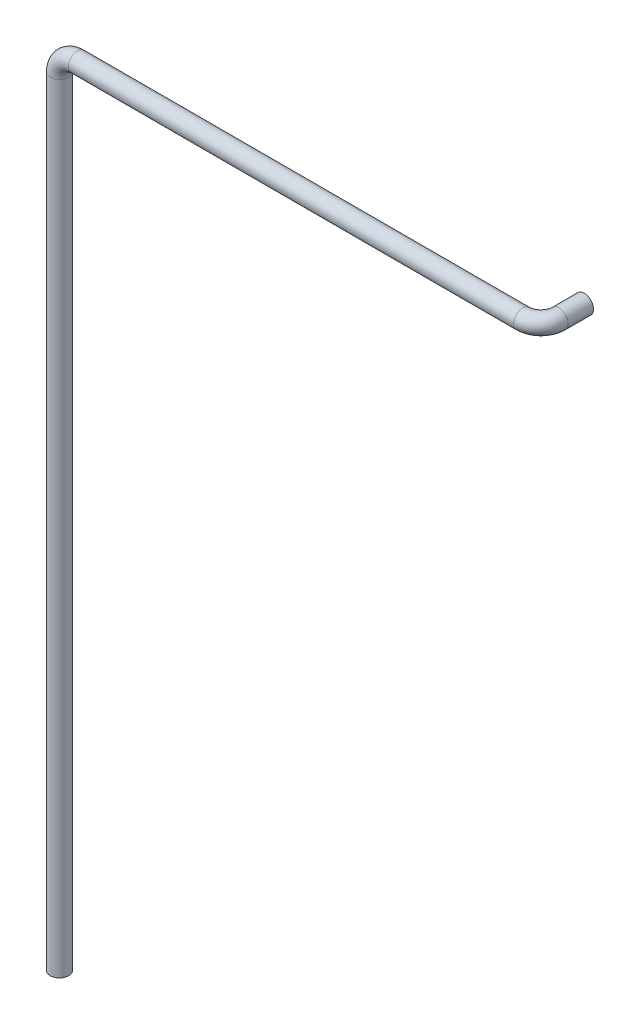
ISO-10303-21;
HEADER;
FILE_DESCRIPTION(('STEP AP214'),'2;1');
FILE_NAME('part.step','',(''),(''),'','','');
FILE_SCHEMA(('AUTOMOTIVE_DESIGN { 1 0 10303 214 1 1 1 1 }'));
ENDSEC;
DATA;
#1=APPLICATION_CONTEXT('core data for automotive mechanical design processes');
#2=APPLICATION_PROTOCOL_DEFINITION('international standard','automotive_design',2000,#1);
#3=PRODUCT_CONTEXT('',#1,'mechanical');
#4=PRODUCT('Part','Part','',(#3));
#5=PRODUCT_RELATED_PRODUCT_CATEGORY('part','',(#4));
#6=PRODUCT_DEFINITION_FORMATION('','',#4);
#7=PRODUCT_DEFINITION_CONTEXT('part definition',#1,'design');
#8=PRODUCT_DEFINITION('design','',#6,#7);
#9=PRODUCT_DEFINITION_SHAPE('','',#8);
#10=(LENGTH_UNIT() NAMED_UNIT(*) SI_UNIT(.MILLI.,.METRE.));
#11=(NAMED_UNIT(*) PLANE_ANGLE_UNIT() SI_UNIT($,.RADIAN.));
#12=(NAMED_UNIT(*) SI_UNIT($,.STERADIAN.) SOLID_ANGLE_UNIT());
#13=UNCERTAINTY_MEASURE_WITH_UNIT(LENGTH_MEASURE(1.E-05),#10,'distance_accuracy_value','');
#14=(GEOMETRIC_REPRESENTATION_CONTEXT(3) GLOBAL_UNCERTAINTY_ASSIGNED_CONTEXT((#13)) GLOBAL_UNIT_ASSIGNED_CONTEXT((#10,
#11,#12)) REPRESENTATION_CONTEXT('',''));
#15=CARTESIAN_POINT('',(0.,0.,0.));
#16=DIRECTION('',(0.,0.,1.));
#17=DIRECTION('',(1.,0.,0.));
#18=AXIS2_PLACEMENT_3D('',#15,#16,#17);
#19=CARTESIAN_POINT('',(0.,860.,0.));
#20=DIRECTION('',(0.,-1.,0.));
#21=DIRECTION('',(0.,0.,-1.));
#22=AXIS2_PLACEMENT_3D('',#19,#20,#21);
#23=CYLINDRICAL_SURFACE('',#22,12.7);
#24=CARTESIAN_POINT('',(0.,0.,0.));
#25=DIRECTION('',(0.,1.,0.));
#26=DIRECTION('',(0.,0.,1.));
#27=AXIS2_PLACEMENT_3D('',#24,#25,#26);
#28=CIRCLE('',#27,12.7);
#29=CARTESIAN_POINT('',(0.,0.,12.7));
#30=VERTEX_POINT('',#29);
#31=EDGE_CURVE('E11',#30,#30,#28,.T.);
#32=ORIENTED_EDGE('',*,*,#31,.T.);
#33=EDGE_LOOP('',(#32));
#34=FACE_BOUND('',#33,.T.);
#35=CARTESIAN_POINT('',(0.,1075.,0.));
#36=DIRECTION('',(0.,1.,0.));
#37=DIRECTION('',(0.,0.,1.));
#38=AXIS2_PLACEMENT_3D('',#35,#36,#37);
#39=CIRCLE('',#38,12.7);
#40=CARTESIAN_POINT('',(-12.7,1075.,0.));
#41=VERTEX_POINT('',#40);
#42=EDGE_CURVE('E57',#41,#41,#39,.T.);
#43=ORIENTED_EDGE('',*,*,#42,.F.);
#44=EDGE_LOOP('',(#43));
#45=FACE_BOUND('',#44,.T.);
#46=ADVANCED_FACE('F35',(#34,#45),#23,.T.);
#47=CARTESIAN_POINT('',(0.,0.,0.));
#48=DIRECTION('',(0.,1.,0.));
#49=DIRECTION('',(0.,0.,1.));
#50=AXIS2_PLACEMENT_3D('',#47,#48,#49);
#51=PLANE('',#50);
#52=ORIENTED_EDGE('',*,*,#31,.F.);
#53=EDGE_LOOP('',(#52));
#54=FACE_BOUND('',#53,.T.);
#55=ADVANCED_FACE('F64',(#54),#51,.F.);
#56=CARTESIAN_POINT('',(665.,1100.,-59.9999999999999));
#57=DIRECTION('',(0.,0.,-1.));
#58=DIRECTION('',(1.,0.,0.));
#59=AXIS2_PLACEMENT_3D('',#56,#57,#58);
#60=PLANE('',#59);
#61=CARTESIAN_POINT('',(665.,1100.,-59.9999999999999));
#62=DIRECTION('',(0.,0.,-1.));
#63=DIRECTION('',(1.,0.,0.));
#64=AXIS2_PLACEMENT_3D('',#61,#62,#63);
#65=CIRCLE('',#64,12.7);
#66=CARTESIAN_POINT('',(677.7,1100.,-59.9999999999999));
#67=VERTEX_POINT('',#66);
#68=EDGE_CURVE('E41',#67,#67,#65,.T.);
#69=ORIENTED_EDGE('',*,*,#68,.T.);
#70=EDGE_LOOP('',(#69));
#71=FACE_BOUND('',#70,.T.);
#72=ADVANCED_FACE('F45',(#71),#60,.T.);
#73=CARTESIAN_POINT('',(25.,1075.,0.));
#74=DIRECTION('',(0.,0.,-1.));
#75=DIRECTION('',(-1.,0.,0.));
#76=AXIS2_PLACEMENT_3D('',#73,#74,#75);
#77=TOROIDAL_SURFACE('',#76,25.,12.7);
#78=CARTESIAN_POINT('',(25.,1100.,0.));
#79=DIRECTION('',(1.,0.,0.));
#80=DIRECTION('',(0.,0.,1.));
#81=AXIS2_PLACEMENT_3D('',#78,#79,#80);
#82=CIRCLE('',#81,12.7);
#83=CARTESIAN_POINT('',(25.,1112.7,0.));
#84=VERTEX_POINT('',#83);
#85=EDGE_CURVE('E54',#84,#84,#82,.T.);
#86=CARTESIAN_POINT('',(25.,1075.,0.));
#87=DIRECTION('',(0.,0.,-1.));
#88=DIRECTION('',(-1.,0.,0.));
#89=AXIS2_PLACEMENT_3D('',#86,#87,#88);
#90=CIRCLE('',#89,37.7);
#91=EDGE_CURVE('',#41,#84,#90,.T.);
#92=ORIENTED_EDGE('',*,*,#42,.T.);
#93=ORIENTED_EDGE('',*,*,#85,.F.);
#94=ORIENTED_EDGE('',*,*,#91,.T.);
#95=ORIENTED_EDGE('',*,*,#91,.F.);
#96=EDGE_LOOP('',(#92,#94,#93,#95));
#97=FACE_BOUND('',#96,.T.);
#98=ADVANCED_FACE('F61',(#97),#77,.T.);
#99=CARTESIAN_POINT('',(25.,1100.,0.));
#100=DIRECTION('',(1.,0.,0.));
#101=DIRECTION('',(0.,0.,-1.));
#102=AXIS2_PLACEMENT_3D('',#99,#100,#101);
#103=CYLINDRICAL_SURFACE('',#102,12.7);
#104=CARTESIAN_POINT('',(640.,1100.,0.));
#105=DIRECTION('',(1.,0.,0.));
#106=DIRECTION('',(0.,0.,1.));
#107=AXIS2_PLACEMENT_3D('',#104,#105,#106);
#108=CIRCLE('',#107,12.7);
#109=CARTESIAN_POINT('',(640.,1100.,12.7));
#110=VERTEX_POINT('',#109);
#111=EDGE_CURVE('E49',#110,#110,#108,.T.);
#112=ORIENTED_EDGE('',*,*,#111,.F.);
#113=EDGE_LOOP('',(#112));
#114=FACE_BOUND('',#113,.T.);
#115=ORIENTED_EDGE('',*,*,#85,.T.);
#116=EDGE_LOOP('',(#115));
#117=FACE_BOUND('',#116,.T.);
#118=ADVANCED_FACE('F82',(#114,#117),#103,.T.);
#119=CARTESIAN_POINT('',(640.,1100.,-25.));
#120=DIRECTION('',(0.,1.,0.));
#121=DIRECTION('',(0.,0.,1.));
#122=AXIS2_PLACEMENT_3D('',#119,#120,#121);
#123=TOROIDAL_SURFACE('',#122,25.,12.7);
#124=CARTESIAN_POINT('',(665.,1100.,-25.));
#125=DIRECTION('',(0.,0.,-1.));
#126=DIRECTION('',(1.,0.,0.));
#127=AXIS2_PLACEMENT_3D('',#124,#125,#126);
#128=CIRCLE('',#127,12.7);
#129=CARTESIAN_POINT('',(677.7,1100.,-25.));
#130=VERTEX_POINT('',#129);
#131=EDGE_CURVE('E47',#130,#130,#128,.T.);
#132=CARTESIAN_POINT('',(640.,1100.,-25.));
#133=DIRECTION('',(0.,1.,0.));
#134=DIRECTION('',(0.,0.,1.));
#135=AXIS2_PLACEMENT_3D('',#132,#133,#134);
#136=CIRCLE('',#135,37.7);
#137=EDGE_CURVE('',#110,#130,#136,.T.);
#138=ORIENTED_EDGE('',*,*,#111,.T.);
#139=ORIENTED_EDGE('',*,*,#131,.F.);
#140=ORIENTED_EDGE('',*,*,#137,.T.);
#141=ORIENTED_EDGE('',*,*,#137,.F.);
#142=EDGE_LOOP('',(#138,#140,#139,#141));
#143=FACE_BOUND('',#142,.T.);
#144=ADVANCED_FACE('F77',(#143),#123,.T.);
#145=CARTESIAN_POINT('',(665.,1100.,-25.));
#146=DIRECTION('',(0.,0.,-1.));
#147=DIRECTION('',(-1.,0.,0.));
#148=AXIS2_PLACEMENT_3D('',#145,#146,#147);
#149=CYLINDRICAL_SURFACE('',#148,12.7);
#150=ORIENTED_EDGE('',*,*,#68,.F.);
#151=EDGE_LOOP('',(#150));
#152=FACE_BOUND('',#151,.T.);
#153=ORIENTED_EDGE('',*,*,#131,.T.);
#154=EDGE_LOOP('',(#153));
#155=FACE_BOUND('',#154,.T.);
#156=ADVANCED_FACE('F70',(#152,#155),#149,.T.);
#157=CLOSED_SHELL('',(#46,#55,#72,#98,#118,#144,#156));
#158=MANIFOLD_SOLID_BREP('B2',#157);
#159=ADVANCED_BREP_SHAPE_REPRESENTATION('',(#18,#158),#14);
#160=SHAPE_DEFINITION_REPRESENTATION(#9,#159);
ENDSEC;
END-ISO-10303-21;
